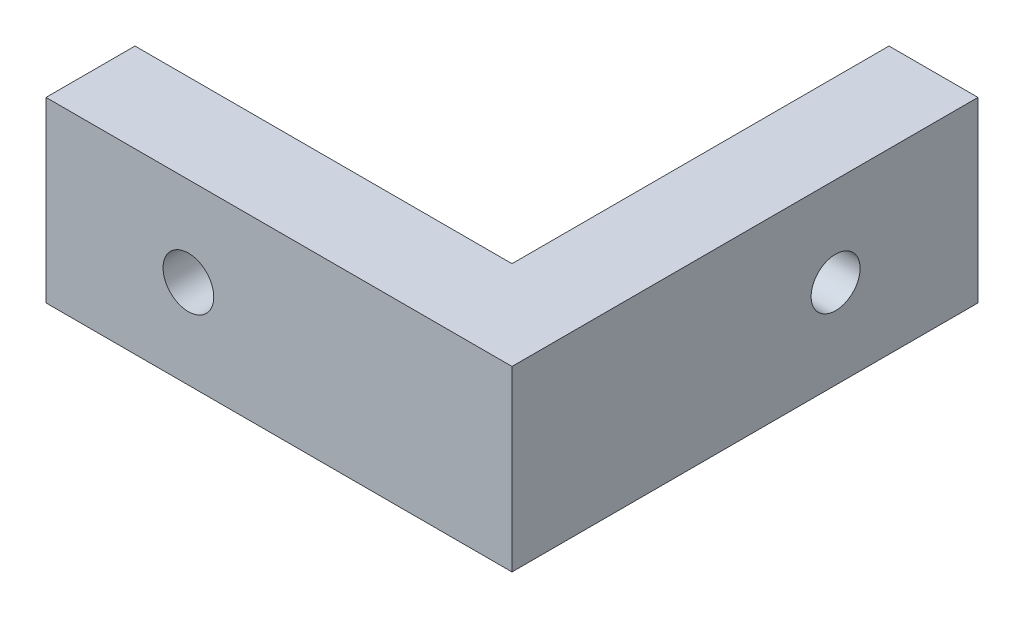
ISO-10303-21;
HEADER;
FILE_DESCRIPTION(('STEP AP214'),'2;1');
FILE_NAME('part.step','',(''),(''),'','','');
FILE_SCHEMA(('AUTOMOTIVE_DESIGN { 1 0 10303 214 1 1 1 1 }'));
ENDSEC;
DATA;
#1=APPLICATION_CONTEXT('core data for automotive mechanical design processes');
#2=APPLICATION_PROTOCOL_DEFINITION('international standard','automotive_design',2000,#1);
#3=PRODUCT_CONTEXT('',#1,'mechanical');
#4=PRODUCT('Part','Part','',(#3));
#5=PRODUCT_RELATED_PRODUCT_CATEGORY('part','',(#4));
#6=PRODUCT_DEFINITION_FORMATION('','',#4);
#7=PRODUCT_DEFINITION_CONTEXT('part definition',#1,'design');
#8=PRODUCT_DEFINITION('design','',#6,#7);
#9=PRODUCT_DEFINITION_SHAPE('','',#8);
#10=(LENGTH_UNIT() NAMED_UNIT(*) SI_UNIT(.MILLI.,.METRE.));
#11=(NAMED_UNIT(*) PLANE_ANGLE_UNIT() SI_UNIT($,.RADIAN.));
#12=(NAMED_UNIT(*) SI_UNIT($,.STERADIAN.) SOLID_ANGLE_UNIT());
#13=UNCERTAINTY_MEASURE_WITH_UNIT(LENGTH_MEASURE(1.E-05),#10,'distance_accuracy_value','');
#14=(GEOMETRIC_REPRESENTATION_CONTEXT(3) GLOBAL_UNCERTAINTY_ASSIGNED_CONTEXT((#13)) GLOBAL_UNIT_ASSIGNED_CONTEXT((#10,
#11,#12)) REPRESENTATION_CONTEXT('',''));
#15=CARTESIAN_POINT('',(0.,0.,0.));
#16=DIRECTION('',(0.,0.,1.));
#17=DIRECTION('',(1.,0.,0.));
#18=AXIS2_PLACEMENT_3D('',#15,#16,#17);
#19=CARTESIAN_POINT('',(0.,10.,0.));
#20=DIRECTION('',(-1.,0.,0.));
#21=DIRECTION('',(0.,0.,1.));
#22=AXIS2_PLACEMENT_3D('',#19,#20,#21);
#23=PLANE('',#22);
#24=CARTESIAN_POINT('',(0.,5.,-18.18));
#25=DIRECTION('',(1.,0.,0.));
#26=DIRECTION('',(0.,0.,-1.));
#27=AXIS2_PLACEMENT_3D('',#24,#25,#26);
#28=CIRCLE('',#27,1.375);
#29=CARTESIAN_POINT('',(0.,5.,-19.555));
#30=VERTEX_POINT('',#29);
#31=EDGE_CURVE('E182',#30,#30,#28,.T.);
#32=ORIENTED_EDGE('',*,*,#31,.F.);
#33=EDGE_LOOP('',(#32));
#34=FACE_BOUND('',#33,.T.);
#35=DIRECTION('',(0.,0.,-1.));
#36=VECTOR('',#35,1.);
#37=CARTESIAN_POINT('',(0.,0.,0.));
#38=LINE('',#37,#36);
#39=CARTESIAN_POINT('',(0.,0.,0.));
#40=VERTEX_POINT('',#39);
#41=CARTESIAN_POINT('',(0.,0.,-26.18));
#42=VERTEX_POINT('',#41);
#43=EDGE_CURVE('E128',#40,#42,#38,.T.);
#44=ORIENTED_EDGE('',*,*,#43,.T.);
#45=DIRECTION('',(0.,-1.,0.));
#46=VECTOR('',#45,1.);
#47=CARTESIAN_POINT('',(0.,10.,-26.18));
#48=LINE('',#47,#46);
#49=CARTESIAN_POINT('',(0.,10.,-26.18));
#50=VERTEX_POINT('',#49);
#51=EDGE_CURVE('E11',#50,#42,#48,.T.);
#52=ORIENTED_EDGE('',*,*,#51,.F.);
#53=DIRECTION('',(0.,0.,-1.));
#54=VECTOR('',#53,1.);
#55=CARTESIAN_POINT('',(0.,10.,0.));
#56=LINE('',#55,#54);
#57=CARTESIAN_POINT('',(0.,10.,0.));
#58=VERTEX_POINT('',#57);
#59=EDGE_CURVE('E145',#58,#50,#56,.T.);
#60=ORIENTED_EDGE('',*,*,#59,.F.);
#61=DIRECTION('',(0.,-1.,0.));
#62=VECTOR('',#61,1.);
#63=CARTESIAN_POINT('',(0.,10.,0.));
#64=LINE('',#63,#62);
#65=EDGE_CURVE('E124',#58,#40,#64,.T.);
#66=ORIENTED_EDGE('',*,*,#65,.T.);
#67=EDGE_LOOP('',(#44,#52,#60,#66));
#68=FACE_BOUND('',#67,.T.);
#69=ADVANCED_FACE('F39',(#34,#68),#23,.F.);
#70=CARTESIAN_POINT('',(-5.,10.,-26.18));
#71=DIRECTION('',(0.,0.,1.));
#72=DIRECTION('',(1.,0.,0.));
#73=AXIS2_PLACEMENT_3D('',#70,#71,#72);
#74=PLANE('',#73);
#75=DIRECTION('',(-1.,0.,0.));
#76=VECTOR('',#75,1.);
#77=CARTESIAN_POINT('',(-5.,0.,-26.18));
#78=LINE('',#77,#76);
#79=CARTESIAN_POINT('',(-5.,0.,-26.18));
#80=VERTEX_POINT('',#79);
#81=EDGE_CURVE('E132',#42,#80,#78,.T.);
#82=ORIENTED_EDGE('',*,*,#81,.T.);
#83=DIRECTION('',(0.,-1.,0.));
#84=VECTOR('',#83,1.);
#85=CARTESIAN_POINT('',(-5.,10.,-26.18));
#86=LINE('',#85,#84);
#87=CARTESIAN_POINT('',(-5.,10.,-26.18));
#88=VERTEX_POINT('',#87);
#89=EDGE_CURVE('E48',#88,#80,#86,.T.);
#90=ORIENTED_EDGE('',*,*,#89,.F.);
#91=DIRECTION('',(-1.,0.,0.));
#92=VECTOR('',#91,1.);
#93=CARTESIAN_POINT('',(-5.,10.,-26.18));
#94=LINE('',#93,#92);
#95=EDGE_CURVE('E93',#50,#88,#94,.T.);
#96=ORIENTED_EDGE('',*,*,#95,.F.);
#97=ORIENTED_EDGE('',*,*,#51,.T.);
#98=EDGE_LOOP('',(#82,#90,#96,#97));
#99=FACE_BOUND('',#98,.T.);
#100=ADVANCED_FACE('F175',(#99),#74,.F.);
#101=CARTESIAN_POINT('',(-5.,10.,-5.));
#102=DIRECTION('',(1.,0.,0.));
#103=DIRECTION('',(0.,0.,-1.));
#104=AXIS2_PLACEMENT_3D('',#101,#102,#103);
#105=PLANE('',#104);
#106=CARTESIAN_POINT('',(-5.,5.,-18.18));
#107=DIRECTION('',(1.,0.,0.));
#108=DIRECTION('',(0.,0.,-1.));
#109=AXIS2_PLACEMENT_3D('',#106,#107,#108);
#110=CIRCLE('',#109,1.375);
#111=CARTESIAN_POINT('',(-5.,5.,-19.555));
#112=VERTEX_POINT('',#111);
#113=EDGE_CURVE('E185',#112,#112,#110,.F.);
#114=ORIENTED_EDGE('',*,*,#113,.F.);
#115=EDGE_LOOP('',(#114));
#116=FACE_BOUND('',#115,.T.);
#117=DIRECTION('',(0.,0.,1.));
#118=VECTOR('',#117,1.);
#119=CARTESIAN_POINT('',(-5.,0.,-5.));
#120=LINE('',#119,#118);
#121=CARTESIAN_POINT('',(-5.,0.,-5.));
#122=VERTEX_POINT('',#121);
#123=EDGE_CURVE('E136',#80,#122,#120,.T.);
#124=ORIENTED_EDGE('',*,*,#123,.T.);
#125=DIRECTION('',(0.,-1.,0.));
#126=VECTOR('',#125,1.);
#127=CARTESIAN_POINT('',(-5.,10.,-5.));
#128=LINE('',#127,#126);
#129=CARTESIAN_POINT('',(-5.,10.,-5.));
#130=VERTEX_POINT('',#129);
#131=EDGE_CURVE('E117',#130,#122,#128,.T.);
#132=ORIENTED_EDGE('',*,*,#131,.F.);
#133=DIRECTION('',(0.,0.,1.));
#134=VECTOR('',#133,1.);
#135=CARTESIAN_POINT('',(-5.,10.,-5.));
#136=LINE('',#135,#134);
#137=EDGE_CURVE('E106',#88,#130,#136,.T.);
#138=ORIENTED_EDGE('',*,*,#137,.F.);
#139=ORIENTED_EDGE('',*,*,#89,.T.);
#140=EDGE_LOOP('',(#124,#132,#138,#139));
#141=FACE_BOUND('',#140,.T.);
#142=ADVANCED_FACE('F155',(#116,#141),#105,.F.);
#143=CARTESIAN_POINT('',(-5.,10.,-5.));
#144=DIRECTION('',(0.,0.,1.));
#145=DIRECTION('',(1.,0.,0.));
#146=AXIS2_PLACEMENT_3D('',#143,#144,#145);
#147=PLANE('',#146);
#148=CARTESIAN_POINT('',(-18.18,5.,-5.));
#149=DIRECTION('',(0.,0.,1.));
#150=DIRECTION('',(1.,0.,0.));
#151=AXIS2_PLACEMENT_3D('',#148,#149,#150);
#152=CIRCLE('',#151,1.425);
#153=CARTESIAN_POINT('',(-16.755,5.,-5.));
#154=VERTEX_POINT('',#153);
#155=EDGE_CURVE('E133',#154,#154,#152,.F.);
#156=ORIENTED_EDGE('',*,*,#155,.F.);
#157=EDGE_LOOP('',(#156));
#158=FACE_BOUND('',#157,.T.);
#159=DIRECTION('',(-1.,0.,0.));
#160=VECTOR('',#159,1.);
#161=CARTESIAN_POINT('',(-5.,0.,-5.));
#162=LINE('',#161,#160);
#163=CARTESIAN_POINT('',(-26.18,0.,-5.));
#164=VERTEX_POINT('',#163);
#165=EDGE_CURVE('E115',#122,#164,#162,.T.);
#166=ORIENTED_EDGE('',*,*,#165,.T.);
#167=DIRECTION('',(0.,-1.,0.));
#168=VECTOR('',#167,1.);
#169=CARTESIAN_POINT('',(-26.18,10.,-5.));
#170=LINE('',#169,#168);
#171=CARTESIAN_POINT('',(-26.18,10.,-5.));
#172=VERTEX_POINT('',#171);
#173=EDGE_CURVE('E112',#172,#164,#170,.T.);
#174=ORIENTED_EDGE('',*,*,#173,.F.);
#175=DIRECTION('',(-1.,0.,0.));
#176=VECTOR('',#175,1.);
#177=CARTESIAN_POINT('',(-5.,10.,-5.));
#178=LINE('',#177,#176);
#179=EDGE_CURVE('E100',#130,#172,#178,.T.);
#180=ORIENTED_EDGE('',*,*,#179,.F.);
#181=ORIENTED_EDGE('',*,*,#131,.T.);
#182=EDGE_LOOP('',(#166,#174,#180,#181));
#183=FACE_BOUND('',#182,.T.);
#184=ADVANCED_FACE('F113',(#158,#183),#147,.F.);
#185=CARTESIAN_POINT('',(-26.18,10.,0.));
#186=DIRECTION('',(1.,0.,0.));
#187=DIRECTION('',(0.,0.,-1.));
#188=AXIS2_PLACEMENT_3D('',#185,#186,#187);
#189=PLANE('',#188);
#190=DIRECTION('',(0.,0.,1.));
#191=VECTOR('',#190,1.);
#192=CARTESIAN_POINT('',(-26.18,0.,0.));
#193=LINE('',#192,#191);
#194=CARTESIAN_POINT('',(-26.18,0.,0.));
#195=VERTEX_POINT('',#194);
#196=EDGE_CURVE('E79',#164,#195,#193,.T.);
#197=ORIENTED_EDGE('',*,*,#196,.T.);
#198=DIRECTION('',(0.,-1.,0.));
#199=VECTOR('',#198,1.);
#200=CARTESIAN_POINT('',(-26.18,10.,0.));
#201=LINE('',#200,#199);
#202=CARTESIAN_POINT('',(-26.18,10.,0.));
#203=VERTEX_POINT('',#202);
#204=EDGE_CURVE('E118',#203,#195,#201,.T.);
#205=ORIENTED_EDGE('',*,*,#204,.F.);
#206=DIRECTION('',(0.,0.,1.));
#207=VECTOR('',#206,1.);
#208=CARTESIAN_POINT('',(-26.18,10.,0.));
#209=LINE('',#208,#207);
#210=EDGE_CURVE('E104',#172,#203,#209,.T.);
#211=ORIENTED_EDGE('',*,*,#210,.F.);
#212=ORIENTED_EDGE('',*,*,#173,.T.);
#213=EDGE_LOOP('',(#197,#205,#211,#212));
#214=FACE_BOUND('',#213,.T.);
#215=ADVANCED_FACE('F120',(#214),#189,.F.);
#216=CARTESIAN_POINT('',(0.,10.,0.));
#217=DIRECTION('',(0.,0.,-1.));
#218=DIRECTION('',(-1.,0.,0.));
#219=AXIS2_PLACEMENT_3D('',#216,#217,#218);
#220=PLANE('',#219);
#221=CARTESIAN_POINT('',(-18.18,5.,0.));
#222=DIRECTION('',(0.,0.,1.));
#223=DIRECTION('',(1.,0.,0.));
#224=AXIS2_PLACEMENT_3D('',#221,#222,#223);
#225=CIRCLE('',#224,1.425);
#226=CARTESIAN_POINT('',(-16.755,5.,0.));
#227=VERTEX_POINT('',#226);
#228=EDGE_CURVE('E189',#227,#227,#225,.T.);
#229=ORIENTED_EDGE('',*,*,#228,.F.);
#230=EDGE_LOOP('',(#229));
#231=FACE_BOUND('',#230,.T.);
#232=DIRECTION('',(1.,0.,0.));
#233=VECTOR('',#232,1.);
#234=CARTESIAN_POINT('',(0.,0.,0.));
#235=LINE('',#234,#233);
#236=EDGE_CURVE('E85',#195,#40,#235,.T.);
#237=ORIENTED_EDGE('',*,*,#236,.T.);
#238=ORIENTED_EDGE('',*,*,#65,.F.);
#239=DIRECTION('',(1.,0.,0.));
#240=VECTOR('',#239,1.);
#241=CARTESIAN_POINT('',(0.,10.,0.));
#242=LINE('',#241,#240);
#243=EDGE_CURVE('E56',#203,#58,#242,.T.);
#244=ORIENTED_EDGE('',*,*,#243,.F.);
#245=ORIENTED_EDGE('',*,*,#204,.T.);
#246=EDGE_LOOP('',(#237,#238,#244,#245));
#247=FACE_BOUND('',#246,.T.);
#248=ADVANCED_FACE('F162',(#231,#247),#220,.F.);
#249=CARTESIAN_POINT('',(0.,10.,0.));
#250=DIRECTION('',(0.,-1.,0.));
#251=DIRECTION('',(0.,0.,-1.));
#252=AXIS2_PLACEMENT_3D('',#249,#250,#251);
#253=PLANE('',#252);
#254=ORIENTED_EDGE('',*,*,#59,.T.);
#255=ORIENTED_EDGE('',*,*,#95,.T.);
#256=ORIENTED_EDGE('',*,*,#137,.T.);
#257=ORIENTED_EDGE('',*,*,#179,.T.);
#258=ORIENTED_EDGE('',*,*,#210,.T.);
#259=ORIENTED_EDGE('',*,*,#243,.T.);
#260=EDGE_LOOP('',(#254,#255,#256,#257,#258,#259));
#261=FACE_BOUND('',#260,.T.);
#262=ADVANCED_FACE('F102',(#261),#253,.F.);
#263=CARTESIAN_POINT('',(0.,0.,0.));
#264=DIRECTION('',(0.,-1.,0.));
#265=DIRECTION('',(0.,0.,-1.));
#266=AXIS2_PLACEMENT_3D('',#263,#264,#265);
#267=PLANE('',#266);
#268=ORIENTED_EDGE('',*,*,#43,.F.);
#269=ORIENTED_EDGE('',*,*,#236,.F.);
#270=ORIENTED_EDGE('',*,*,#196,.F.);
#271=ORIENTED_EDGE('',*,*,#165,.F.);
#272=ORIENTED_EDGE('',*,*,#123,.F.);
#273=ORIENTED_EDGE('',*,*,#81,.F.);
#274=EDGE_LOOP('',(#268,#269,#270,#271,#272,#273));
#275=FACE_BOUND('',#274,.T.);
#276=ADVANCED_FACE('F158',(#275),#267,.T.);
#277=CARTESIAN_POINT('',(-18.18,5.,-26.181));
#278=DIRECTION('',(0.,0.,1.));
#279=DIRECTION('',(1.,0.,0.));
#280=AXIS2_PLACEMENT_3D('',#277,#278,#279);
#281=CYLINDRICAL_SURFACE('',#280,1.425);
#282=CARTESIAN_POINT('',(-16.755,5.,0.));
#283=CARTESIAN_POINT('',(-16.755,5.,-0.0520833333333334));
#284=CARTESIAN_POINT('',(-16.755,5.,-0.104166666666667));
#285=CARTESIAN_POINT('',(-16.755,5.,-0.208333333333334));
#286=CARTESIAN_POINT('',(-16.755,5.,-0.260416666666667));
#287=CARTESIAN_POINT('',(-16.755,5.,-0.364583333333334));
#288=CARTESIAN_POINT('',(-16.755,5.,-0.416666666666667));
#289=CARTESIAN_POINT('',(-16.755,5.,-0.520833333333334));
#290=CARTESIAN_POINT('',(-16.755,5.,-0.572916666666667));
#291=CARTESIAN_POINT('',(-16.755,5.,-0.677083333333334));
#292=CARTESIAN_POINT('',(-16.755,5.,-0.729166666666667));
#293=CARTESIAN_POINT('',(-16.755,5.,-0.833333333333334));
#294=CARTESIAN_POINT('',(-16.755,5.,-0.885416666666668));
#295=CARTESIAN_POINT('',(-16.755,5.,-0.989583333333334));
#296=CARTESIAN_POINT('',(-16.755,5.,-1.04166666666667));
#297=CARTESIAN_POINT('',(-16.755,5.,-1.14583333333333));
#298=CARTESIAN_POINT('',(-16.755,5.,-1.19791666666667));
#299=CARTESIAN_POINT('',(-16.755,5.,-1.30208333333333));
#300=CARTESIAN_POINT('',(-16.755,5.,-1.35416666666667));
#301=CARTESIAN_POINT('',(-16.755,5.,-1.45833333333333));
#302=CARTESIAN_POINT('',(-16.755,5.,-1.51041666666667));
#303=CARTESIAN_POINT('',(-16.755,5.,-1.61458333333333));
#304=CARTESIAN_POINT('',(-16.755,5.,-1.66666666666667));
#305=CARTESIAN_POINT('',(-16.755,5.,-1.77083333333334));
#306=CARTESIAN_POINT('',(-16.755,5.,-1.82291666666667));
#307=CARTESIAN_POINT('',(-16.755,5.,-1.92708333333334));
#308=CARTESIAN_POINT('',(-16.755,5.,-1.97916666666667));
#309=CARTESIAN_POINT('',(-16.755,5.,-2.08333333333334));
#310=CARTESIAN_POINT('',(-16.755,5.,-2.13541666666667));
#311=CARTESIAN_POINT('',(-16.755,5.,-2.23958333333334));
#312=CARTESIAN_POINT('',(-16.755,5.,-2.29166666666667));
#313=CARTESIAN_POINT('',(-16.755,5.,-2.39583333333334));
#314=CARTESIAN_POINT('',(-16.755,5.,-2.44791666666667));
#315=CARTESIAN_POINT('',(-16.755,5.,-2.55208333333334));
#316=CARTESIAN_POINT('',(-16.755,5.,-2.60416666666667));
#317=CARTESIAN_POINT('',(-16.755,5.,-2.70833333333334));
#318=CARTESIAN_POINT('',(-16.755,5.,-2.76041666666667));
#319=CARTESIAN_POINT('',(-16.755,5.,-2.86458333333334));
#320=CARTESIAN_POINT('',(-16.755,5.,-2.91666666666667));
#321=CARTESIAN_POINT('',(-16.755,5.,-3.02083333333334));
#322=CARTESIAN_POINT('',(-16.755,5.,-3.07291666666667));
#323=CARTESIAN_POINT('',(-16.755,5.,-3.17708333333334));
#324=CARTESIAN_POINT('',(-16.755,5.,-3.22916666666667));
#325=CARTESIAN_POINT('',(-16.755,5.,-3.33333333333334));
#326=CARTESIAN_POINT('',(-16.755,5.,-3.38541666666667));
#327=CARTESIAN_POINT('',(-16.755,5.,-3.48958333333334));
#328=CARTESIAN_POINT('',(-16.755,5.,-3.54166666666667));
#329=CARTESIAN_POINT('',(-16.755,5.,-3.64583333333334));
#330=CARTESIAN_POINT('',(-16.755,5.,-3.69791666666667));
#331=CARTESIAN_POINT('',(-16.755,5.,-3.80208333333334));
#332=CARTESIAN_POINT('',(-16.755,5.,-3.85416666666667));
#333=CARTESIAN_POINT('',(-16.755,5.,-3.95833333333334));
#334=CARTESIAN_POINT('',(-16.755,5.,-4.01041666666667));
#335=CARTESIAN_POINT('',(-16.755,5.,-4.11458333333334));
#336=CARTESIAN_POINT('',(-16.755,5.,-4.16666666666667));
#337=CARTESIAN_POINT('',(-16.755,5.,-4.27083333333334));
#338=CARTESIAN_POINT('',(-16.755,5.,-4.32291666666667));
#339=CARTESIAN_POINT('',(-16.755,5.,-4.42708333333334));
#340=CARTESIAN_POINT('',(-16.755,5.,-4.47916666666667));
#341=CARTESIAN_POINT('',(-16.755,5.,-4.58333333333334));
#342=CARTESIAN_POINT('',(-16.755,5.,-4.63541666666667));
#343=CARTESIAN_POINT('',(-16.755,5.,-4.73958333333334));
#344=CARTESIAN_POINT('',(-16.755,5.,-4.79166666666667));
#345=CARTESIAN_POINT('',(-16.755,5.,-4.89583333333334));
#346=CARTESIAN_POINT('',(-16.755,5.,-4.94791666666667));
#347=CARTESIAN_POINT('',(-16.755,5.,-5.));
#348=B_SPLINE_CURVE_WITH_KNOTS('',3,(#282,#283,#284,#285,#286,#287,#288,#289,#290,#291,#292,
#293,#294,#295,#296,#297,#298,#299,#300,#301,#302,#303,#304,#305,#306,#307,#308,#309,#310,#311,
#312,#313,#314,#315,#316,#317,#318,#319,#320,#321,#322,#323,#324,#325,#326,#327,#328,#329,#330,
#331,#332,#333,#334,#335,#336,#337,#338,#339,#340,#341,#342,#343,#344,#345,#346,#347),
.UNSPECIFIED.,.F.,.F.,(4,2,2,2,2,2,2,2,2,2,2,2,2,2,2,2,2,2,2,2,2,2,2,2,2,2,2,2,2,2,2,2,4),(0.,
0.15625,0.3125,0.46875,0.625000000000001,0.781250000000001,0.937500000000001,1.09375,1.25,
1.40625,1.5625,1.71875,1.875,2.03125,2.1875,2.34375,2.5,2.65625,2.8125,2.96875,3.125,3.28125,
3.4375,3.59375,3.75,3.90625,4.0625,4.21875,4.375,4.53125,4.6875,4.84375,5.),.UNSPECIFIED.);
#349=EDGE_CURVE('BSEAM204',#227,#154,#348,.T.);
#350=ORIENTED_EDGE('',*,*,#228,.T.);
#351=ORIENTED_EDGE('',*,*,#155,.T.);
#352=ORIENTED_EDGE('',*,*,#349,.T.);
#353=ORIENTED_EDGE('',*,*,#349,.F.);
#354=EDGE_LOOP('',(#350,#352,#351,#353));
#355=FACE_BOUND('',#354,.T.);
#356=ADVANCED_FACE('F204',(#355),#281,.F.);
#357=CARTESIAN_POINT('',(-26.181,5.,-18.18));
#358=DIRECTION('',(1.,0.,0.));
#359=DIRECTION('',(0.,0.,-1.));
#360=AXIS2_PLACEMENT_3D('',#357,#358,#359);
#361=CYLINDRICAL_SURFACE('',#360,1.375);
#362=CARTESIAN_POINT('',(0.,5.,-19.555));
#363=CARTESIAN_POINT('',(-0.0520833333333334,5.,-19.555));
#364=CARTESIAN_POINT('',(-0.104166666666667,5.,-19.555));
#365=CARTESIAN_POINT('',(-0.208333333333334,5.,-19.555));
#366=CARTESIAN_POINT('',(-0.260416666666667,5.,-19.555));
#367=CARTESIAN_POINT('',(-0.364583333333334,5.,-19.555));
#368=CARTESIAN_POINT('',(-0.416666666666667,5.,-19.555));
#369=CARTESIAN_POINT('',(-0.520833333333334,5.,-19.555));
#370=CARTESIAN_POINT('',(-0.572916666666667,5.,-19.555));
#371=CARTESIAN_POINT('',(-0.677083333333334,5.,-19.555));
#372=CARTESIAN_POINT('',(-0.729166666666667,5.,-19.555));
#373=CARTESIAN_POINT('',(-0.833333333333334,5.,-19.555));
#374=CARTESIAN_POINT('',(-0.885416666666668,5.,-19.555));
#375=CARTESIAN_POINT('',(-0.989583333333334,5.,-19.555));
#376=CARTESIAN_POINT('',(-1.04166666666667,5.,-19.555));
#377=CARTESIAN_POINT('',(-1.14583333333333,5.,-19.555));
#378=CARTESIAN_POINT('',(-1.19791666666667,5.,-19.555));
#379=CARTESIAN_POINT('',(-1.30208333333333,5.,-19.555));
#380=CARTESIAN_POINT('',(-1.35416666666667,5.,-19.555));
#381=CARTESIAN_POINT('',(-1.45833333333333,5.,-19.555));
#382=CARTESIAN_POINT('',(-1.51041666666667,5.,-19.555));
#383=CARTESIAN_POINT('',(-1.61458333333333,5.,-19.555));
#384=CARTESIAN_POINT('',(-1.66666666666667,5.,-19.555));
#385=CARTESIAN_POINT('',(-1.77083333333334,5.,-19.555));
#386=CARTESIAN_POINT('',(-1.82291666666667,5.,-19.555));
#387=CARTESIAN_POINT('',(-1.92708333333334,5.,-19.555));
#388=CARTESIAN_POINT('',(-1.97916666666667,5.,-19.555));
#389=CARTESIAN_POINT('',(-2.08333333333334,5.,-19.555));
#390=CARTESIAN_POINT('',(-2.13541666666667,5.,-19.555));
#391=CARTESIAN_POINT('',(-2.23958333333334,5.,-19.555));
#392=CARTESIAN_POINT('',(-2.29166666666667,5.,-19.555));
#393=CARTESIAN_POINT('',(-2.39583333333334,5.,-19.555));
#394=CARTESIAN_POINT('',(-2.44791666666667,5.,-19.555));
#395=CARTESIAN_POINT('',(-2.55208333333334,5.,-19.555));
#396=CARTESIAN_POINT('',(-2.60416666666667,5.,-19.555));
#397=CARTESIAN_POINT('',(-2.70833333333334,5.,-19.555));
#398=CARTESIAN_POINT('',(-2.76041666666667,5.,-19.555));
#399=CARTESIAN_POINT('',(-2.86458333333334,5.,-19.555));
#400=CARTESIAN_POINT('',(-2.91666666666667,5.,-19.555));
#401=CARTESIAN_POINT('',(-3.02083333333334,5.,-19.555));
#402=CARTESIAN_POINT('',(-3.07291666666667,5.,-19.555));
#403=CARTESIAN_POINT('',(-3.17708333333334,5.,-19.555));
#404=CARTESIAN_POINT('',(-3.22916666666667,5.,-19.555));
#405=CARTESIAN_POINT('',(-3.33333333333334,5.,-19.555));
#406=CARTESIAN_POINT('',(-3.38541666666667,5.,-19.555));
#407=CARTESIAN_POINT('',(-3.48958333333334,5.,-19.555));
#408=CARTESIAN_POINT('',(-3.54166666666667,5.,-19.555));
#409=CARTESIAN_POINT('',(-3.64583333333334,5.,-19.555));
#410=CARTESIAN_POINT('',(-3.69791666666667,5.,-19.555));
#411=CARTESIAN_POINT('',(-3.80208333333334,5.,-19.555));
#412=CARTESIAN_POINT('',(-3.85416666666667,5.,-19.555));
#413=CARTESIAN_POINT('',(-3.95833333333334,5.,-19.555));
#414=CARTESIAN_POINT('',(-4.01041666666667,5.,-19.555));
#415=CARTESIAN_POINT('',(-4.11458333333334,5.,-19.555));
#416=CARTESIAN_POINT('',(-4.16666666666667,5.,-19.555));
#417=CARTESIAN_POINT('',(-4.27083333333334,5.,-19.555));
#418=CARTESIAN_POINT('',(-4.32291666666667,5.,-19.555));
#419=CARTESIAN_POINT('',(-4.42708333333334,5.,-19.555));
#420=CARTESIAN_POINT('',(-4.47916666666667,5.,-19.555));
#421=CARTESIAN_POINT('',(-4.58333333333334,5.,-19.555));
#422=CARTESIAN_POINT('',(-4.63541666666667,5.,-19.555));
#423=CARTESIAN_POINT('',(-4.73958333333334,5.,-19.555));
#424=CARTESIAN_POINT('',(-4.79166666666667,5.,-19.555));
#425=CARTESIAN_POINT('',(-4.89583333333334,5.,-19.555));
#426=CARTESIAN_POINT('',(-4.94791666666667,5.,-19.555));
#427=CARTESIAN_POINT('',(-5.,5.,-19.555));
#428=B_SPLINE_CURVE_WITH_KNOTS('',3,(#362,#363,#364,#365,#366,#367,#368,#369,#370,#371,#372,
#373,#374,#375,#376,#377,#378,#379,#380,#381,#382,#383,#384,#385,#386,#387,#388,#389,#390,#391,
#392,#393,#394,#395,#396,#397,#398,#399,#400,#401,#402,#403,#404,#405,#406,#407,#408,#409,#410,
#411,#412,#413,#414,#415,#416,#417,#418,#419,#420,#421,#422,#423,#424,#425,#426,#427),
.UNSPECIFIED.,.F.,.F.,(4,2,2,2,2,2,2,2,2,2,2,2,2,2,2,2,2,2,2,2,2,2,2,2,2,2,2,2,2,2,2,2,4),(0.,
0.15625,0.3125,0.46875,0.625000000000001,0.781250000000001,0.937500000000001,1.09375,1.25,
1.40625,1.5625,1.71875,1.875,2.03125,2.1875,2.34375,2.5,2.65625,2.8125,2.96875,3.125,3.28125,
3.4375,3.59375,3.75,3.90625,4.0625,4.21875,4.375,4.53125,4.6875,4.84375,5.),.UNSPECIFIED.);
#429=EDGE_CURVE('BSEAM217',#30,#112,#428,.T.);
#430=ORIENTED_EDGE('',*,*,#31,.T.);
#431=ORIENTED_EDGE('',*,*,#113,.T.);
#432=ORIENTED_EDGE('',*,*,#429,.T.);
#433=ORIENTED_EDGE('',*,*,#429,.F.);
#434=EDGE_LOOP('',(#430,#432,#431,#433));
#435=FACE_BOUND('',#434,.T.);
#436=ADVANCED_FACE('F217',(#435),#361,.F.);
#437=CLOSED_SHELL('',(#69,#100,#142,#184,#215,#248,#262,#276,#356,#436));
#438=MANIFOLD_SOLID_BREP('B2',#437);
#439=ADVANCED_BREP_SHAPE_REPRESENTATION('',(#18,#438),#14);
#440=SHAPE_DEFINITION_REPRESENTATION(#9,#439);
ENDSEC;
END-ISO-10303-21;
